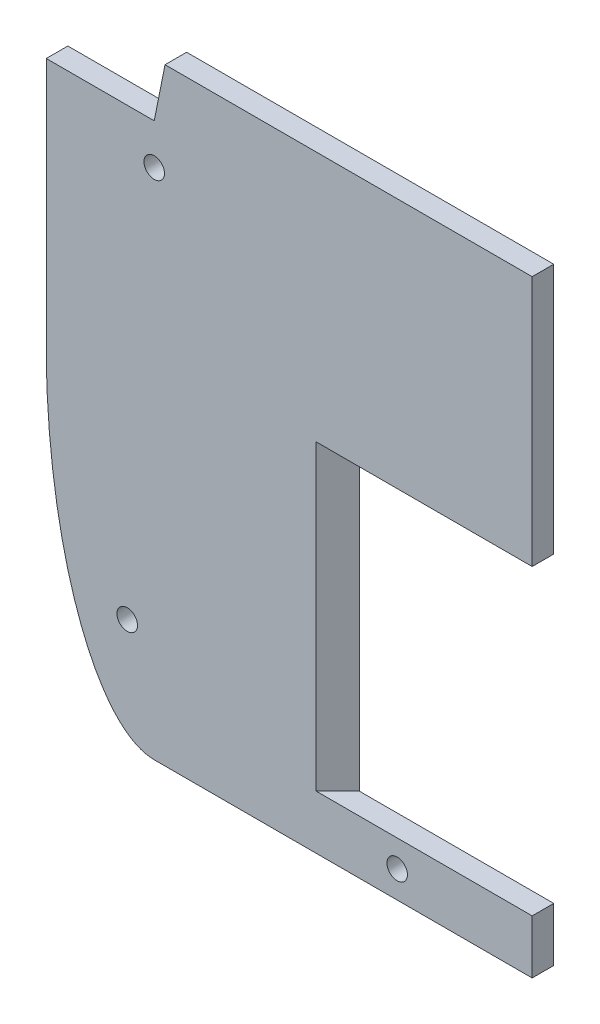
ISO-10303-21;
HEADER;
FILE_DESCRIPTION(('STEP AP214'),'2;1');
FILE_NAME('part.step','',(''),(''),'','','');
FILE_SCHEMA(('AUTOMOTIVE_DESIGN { 1 0 10303 214 1 1 1 1 }'));
ENDSEC;
DATA;
#1=APPLICATION_CONTEXT('core data for automotive mechanical design processes');
#2=APPLICATION_PROTOCOL_DEFINITION('international standard','automotive_design',2000,#1);
#3=PRODUCT_CONTEXT('',#1,'mechanical');
#4=PRODUCT('Part','Part','',(#3));
#5=PRODUCT_RELATED_PRODUCT_CATEGORY('part','',(#4));
#6=PRODUCT_DEFINITION_FORMATION('','',#4);
#7=PRODUCT_DEFINITION_CONTEXT('part definition',#1,'design');
#8=PRODUCT_DEFINITION('design','',#6,#7);
#9=PRODUCT_DEFINITION_SHAPE('','',#8);
#10=(LENGTH_UNIT() NAMED_UNIT(*) SI_UNIT(.MILLI.,.METRE.));
#11=(NAMED_UNIT(*) PLANE_ANGLE_UNIT() SI_UNIT($,.RADIAN.));
#12=(NAMED_UNIT(*) SI_UNIT($,.STERADIAN.) SOLID_ANGLE_UNIT());
#13=UNCERTAINTY_MEASURE_WITH_UNIT(LENGTH_MEASURE(1.E-05),#10,'distance_accuracy_value','');
#14=(GEOMETRIC_REPRESENTATION_CONTEXT(3) GLOBAL_UNCERTAINTY_ASSIGNED_CONTEXT((#13)) GLOBAL_UNIT_ASSIGNED_CONTEXT((#10,
#11,#12)) REPRESENTATION_CONTEXT('',''));
#15=CARTESIAN_POINT('',(0.,0.,0.));
#16=DIRECTION('',(0.,0.,1.));
#17=DIRECTION('',(1.,0.,0.));
#18=AXIS2_PLACEMENT_3D('',#15,#16,#17);
#19=CARTESIAN_POINT('',(0.,130.175,0.));
#20=DIRECTION('',(0.,1.,0.));
#21=DIRECTION('',(0.,0.,1.));
#22=AXIS2_PLACEMENT_3D('',#19,#20,#21);
#23=PLANE('',#22);
#24=DIRECTION('',(0.,0.,1.));
#25=VECTOR('',#24,1.);
#26=CARTESIAN_POINT('',(0.,130.175,0.));
#27=LINE('',#26,#25);
#28=CARTESIAN_POINT('',(0.,130.175,0.));
#29=VERTEX_POINT('',#28);
#30=CARTESIAN_POINT('',(0.,130.175,5.08));
#31=VERTEX_POINT('',#30);
#32=EDGE_CURVE('E279',#29,#31,#27,.T.);
#33=ORIENTED_EDGE('',*,*,#32,.T.);
#34=DIRECTION('',(1.,0.,0.));
#35=VECTOR('',#34,1.);
#36=CARTESIAN_POINT('',(0.,130.175,5.08));
#37=LINE('',#36,#35);
#38=CARTESIAN_POINT('',(25.4,130.175,5.08));
#39=VERTEX_POINT('',#38);
#40=EDGE_CURVE('E166',#31,#39,#37,.T.);
#41=ORIENTED_EDGE('',*,*,#40,.T.);
#42=DIRECTION('',(0.,0.,-1.));
#43=VECTOR('',#42,1.);
#44=CARTESIAN_POINT('',(25.4,130.175,0.));
#45=LINE('',#44,#43);
#46=CARTESIAN_POINT('',(25.4,130.175,0.));
#47=VERTEX_POINT('',#46);
#48=EDGE_CURVE('E315',#39,#47,#45,.T.);
#49=ORIENTED_EDGE('',*,*,#48,.T.);
#50=DIRECTION('',(-1.,0.,0.));
#51=VECTOR('',#50,1.);
#52=CARTESIAN_POINT('',(0.,130.175,0.));
#53=LINE('',#52,#51);
#54=EDGE_CURVE('E283',#47,#29,#53,.T.);
#55=ORIENTED_EDGE('',*,*,#54,.T.);
#56=EDGE_LOOP('',(#33,#41,#49,#55));
#57=FACE_BOUND('',#56,.T.);
#58=ADVANCED_FACE('F45',(#57),#23,.T.);
#59=CARTESIAN_POINT('',(114.3,0.,30.48));
#60=DIRECTION('',(-1.,0.,0.));
#61=DIRECTION('',(0.,0.,1.));
#62=AXIS2_PLACEMENT_3D('',#59,#60,#61);
#63=PLANE('',#62);
#64=DIRECTION('',(0.,1.,0.));
#65=VECTOR('',#64,1.);
#66=CARTESIAN_POINT('',(114.3,0.,0.));
#67=LINE('',#66,#65);
#68=CARTESIAN_POINT('',(114.3,0.,0.));
#69=VERTEX_POINT('',#68);
#70=CARTESIAN_POINT('',(114.3,12.6602922297252,0.));
#71=VERTEX_POINT('',#70);
#72=EDGE_CURVE('E143',#69,#71,#67,.T.);
#73=ORIENTED_EDGE('',*,*,#72,.T.);
#74=DIRECTION('',(0.,0.,1.));
#75=VECTOR('',#74,1.);
#76=CARTESIAN_POINT('',(114.3,12.6602922297252,-0.357505));
#77=LINE('',#76,#75);
#78=CARTESIAN_POINT('',(114.3,12.6602922297252,5.08));
#79=VERTEX_POINT('',#78);
#80=EDGE_CURVE('E130',#71,#79,#77,.T.);
#81=ORIENTED_EDGE('',*,*,#80,.T.);
#82=DIRECTION('',(0.,1.,0.));
#83=VECTOR('',#82,1.);
#84=CARTESIAN_POINT('',(114.3,0.,5.08));
#85=LINE('',#84,#83);
#86=CARTESIAN_POINT('',(114.3,0.,5.08));
#87=VERTEX_POINT('',#86);
#88=EDGE_CURVE('E140',#87,#79,#85,.T.);
#89=ORIENTED_EDGE('',*,*,#88,.F.);
#90=DIRECTION('',(0.,0.,-1.));
#91=VECTOR('',#90,1.);
#92=CARTESIAN_POINT('',(114.3,0.,30.48));
#93=LINE('',#92,#91);
#94=EDGE_CURVE('E306',#87,#69,#93,.T.);
#95=ORIENTED_EDGE('',*,*,#94,.T.);
#96=EDGE_LOOP('',(#73,#81,#89,#95));
#97=FACE_BOUND('',#96,.T.);
#98=ADVANCED_FACE('F139',(#97),#63,.F.);
#99=CARTESIAN_POINT('',(0.,142.875,30.48));
#100=DIRECTION('',(0.,1.,0.));
#101=DIRECTION('',(0.,0.,1.));
#102=AXIS2_PLACEMENT_3D('',#99,#100,#101);
#103=PLANE('',#102);
#104=DIRECTION('',(0.,0.,-1.));
#105=VECTOR('',#104,1.);
#106=CARTESIAN_POINT('',(27.94,142.875,0.));
#107=LINE('',#106,#105);
#108=CARTESIAN_POINT('',(27.94,142.875,5.08));
#109=VERTEX_POINT('',#108);
#110=CARTESIAN_POINT('',(27.94,142.875,0.));
#111=VERTEX_POINT('',#110);
#112=EDGE_CURVE('E271',#109,#111,#107,.T.);
#113=ORIENTED_EDGE('',*,*,#112,.F.);
#114=DIRECTION('',(-1.,0.,0.));
#115=VECTOR('',#114,1.);
#116=CARTESIAN_POINT('',(62.6533333333333,142.875,5.08));
#117=LINE('',#116,#115);
#118=CARTESIAN_POINT('',(114.3,142.875,5.08));
#119=VERTEX_POINT('',#118);
#120=EDGE_CURVE('E286',#119,#109,#117,.T.);
#121=ORIENTED_EDGE('',*,*,#120,.F.);
#122=DIRECTION('',(0.,0.,-1.));
#123=VECTOR('',#122,1.);
#124=CARTESIAN_POINT('',(114.3,142.875,30.48));
#125=LINE('',#124,#123);
#126=CARTESIAN_POINT('',(114.3,142.875,0.));
#127=VERTEX_POINT('',#126);
#128=EDGE_CURVE('E269',#119,#127,#125,.T.);
#129=ORIENTED_EDGE('',*,*,#128,.T.);
#130=DIRECTION('',(1.,0.,0.));
#131=VECTOR('',#130,1.);
#132=CARTESIAN_POINT('',(0.,142.875,0.));
#133=LINE('',#132,#131);
#134=EDGE_CURVE('E293',#111,#127,#133,.T.);
#135=ORIENTED_EDGE('',*,*,#134,.F.);
#136=EDGE_LOOP('',(#113,#121,#129,#135));
#137=FACE_BOUND('',#136,.T.);
#138=ADVANCED_FACE('F245',(#137),#103,.T.);
#139=CARTESIAN_POINT('',(0.,0.,30.48));
#140=DIRECTION('',(-1.,0.,0.));
#141=DIRECTION('',(0.,0.,1.));
#142=AXIS2_PLACEMENT_3D('',#139,#140,#141);
#143=PLANE('',#142);
#144=CARTESIAN_POINT('',(0.,71.501,32.004));
#145=CARTESIAN_POINT('',(0.,71.501,20.828));
#146=CARTESIAN_POINT('',(0.,71.501,9.65199999999998));
#147=CARTESIAN_POINT('',(0.,71.501,-1.524));
#148=(BOUNDED_CURVE() B_SPLINE_CURVE(3,(#144,#145,#146,#147),.UNSPECIFIED.,.F.,
.F.) B_SPLINE_CURVE_WITH_KNOTS((4,4),(-0.032004,0.001524),
.UNSPECIFIED.) CURVE() GEOMETRIC_REPRESENTATION_ITEM() RATIONAL_B_SPLINE_CURVE((1.,1.,1.,1.)) REPRESENTATION_ITEM(''));
#149=CARTESIAN_POINT('',(0.,71.501,0.));
#150=VERTEX_POINT('',#149);
#151=CARTESIAN_POINT('',(0.,71.5009999999999,5.08));
#152=VERTEX_POINT('',#151);
#153=EDGE_CURVE('E230',#150,#152,#148,.F.);
#154=ORIENTED_EDGE('',*,*,#153,.T.);
#155=DIRECTION('',(0.,1.,0.));
#156=VECTOR('',#155,1.);
#157=CARTESIAN_POINT('',(0.,0.,5.08));
#158=LINE('',#157,#156);
#159=EDGE_CURVE('E170',#152,#31,#158,.T.);
#160=ORIENTED_EDGE('',*,*,#159,.T.);
#161=ORIENTED_EDGE('',*,*,#32,.F.);
#162=DIRECTION('',(0.,1.,0.));
#163=VECTOR('',#162,1.);
#164=CARTESIAN_POINT('',(0.,0.,0.));
#165=LINE('',#164,#163);
#166=EDGE_CURVE('E289',#150,#29,#165,.T.);
#167=ORIENTED_EDGE('',*,*,#166,.F.);
#168=EDGE_LOOP('',(#154,#160,#161,#167));
#169=FACE_BOUND('',#168,.T.);
#170=ADVANCED_FACE('F236',(#169),#143,.T.);
#171=CARTESIAN_POINT('',(0.,0.,30.48));
#172=DIRECTION('',(0.,1.,0.));
#173=DIRECTION('',(0.,0.,1.));
#174=AXIS2_PLACEMENT_3D('',#171,#172,#173);
#175=PLANE('',#174);
#176=DIRECTION('',(1.,0.,0.));
#177=VECTOR('',#176,1.);
#178=CARTESIAN_POINT('',(114.3,0.,5.08));
#179=LINE('',#178,#177);
#180=CARTESIAN_POINT('',(25.4,0.,5.08));
#181=VERTEX_POINT('',#180);
#182=EDGE_CURVE('E149',#181,#87,#179,.T.);
#183=ORIENTED_EDGE('',*,*,#182,.F.);
#184=CARTESIAN_POINT('',(25.4,0.,-1.524));
#185=CARTESIAN_POINT('',(25.4,0.,9.65199999999998));
#186=CARTESIAN_POINT('',(25.4,0.,20.828));
#187=CARTESIAN_POINT('',(25.4,0.,32.004));
#188=(BOUNDED_CURVE() B_SPLINE_CURVE(3,(#184,#185,#186,#187),.UNSPECIFIED.,.F.,
.F.) B_SPLINE_CURVE_WITH_KNOTS((4,4),(-0.032004,0.001524),
.UNSPECIFIED.) CURVE() GEOMETRIC_REPRESENTATION_ITEM() RATIONAL_B_SPLINE_CURVE((1.,1.,1.,1.)) REPRESENTATION_ITEM(''));
#189=CARTESIAN_POINT('',(25.4,0.,0.));
#190=VERTEX_POINT('',#189);
#191=EDGE_CURVE('E309',#181,#190,#188,.F.);
#192=ORIENTED_EDGE('',*,*,#191,.T.);
#193=DIRECTION('',(1.,0.,0.));
#194=VECTOR('',#193,1.);
#195=CARTESIAN_POINT('',(0.,0.,0.));
#196=LINE('',#195,#194);
#197=EDGE_CURVE('E301',#190,#69,#196,.T.);
#198=ORIENTED_EDGE('',*,*,#197,.T.);
#199=ORIENTED_EDGE('',*,*,#94,.F.);
#200=EDGE_LOOP('',(#183,#192,#198,#199));
#201=FACE_BOUND('',#200,.T.);
#202=ADVANCED_FACE('F211',(#201),#175,.F.);
#203=DIRECTION('',(0.,-1.,0.));
#204=VECTOR('',#203,1.);
#205=CARTESIAN_POINT('',(114.3,142.875,5.08));
#206=LINE('',#205,#204);
#207=CARTESIAN_POINT('',(114.3,83.82,5.08));
#208=VERTEX_POINT('',#207);
#209=EDGE_CURVE('E266',#119,#208,#206,.T.);
#210=ORIENTED_EDGE('',*,*,#209,.T.);
#211=DIRECTION('',(0.,0.,1.));
#212=VECTOR('',#211,1.);
#213=CARTESIAN_POINT('',(114.3,83.82,-0.357505000000001));
#214=LINE('',#213,#212);
#215=CARTESIAN_POINT('',(114.3,83.82,0.));
#216=VERTEX_POINT('',#215);
#217=EDGE_CURVE('E180',#216,#208,#214,.T.);
#218=ORIENTED_EDGE('',*,*,#217,.F.);
#219=EDGE_CURVE('E296',#216,#127,#67,.T.);
#220=ORIENTED_EDGE('',*,*,#219,.T.);
#221=ORIENTED_EDGE('',*,*,#128,.F.);
#222=EDGE_LOOP('',(#210,#218,#220,#221));
#223=FACE_BOUND('',#222,.T.);
#224=ADVANCED_FACE('F249',(#223),#63,.F.);
#225=CARTESIAN_POINT('',(0.,71.501,-1.524));
#226=CARTESIAN_POINT('',(0.,71.501,9.65199999999998));
#227=CARTESIAN_POINT('',(0.,71.501,20.828));
#228=CARTESIAN_POINT('',(0.,71.501,32.004));
#229=CARTESIAN_POINT('',(0.,0.,-1.524));
#230=CARTESIAN_POINT('',(0.,0.,9.652));
#231=CARTESIAN_POINT('',(0.,0.,20.828));
#232=CARTESIAN_POINT('',(0.,0.,32.004));
#233=CARTESIAN_POINT('',(25.4,0.,-1.524));
#234=CARTESIAN_POINT('',(25.4,0.,9.65199999999998));
#235=CARTESIAN_POINT('',(25.4,0.,20.828));
#236=CARTESIAN_POINT('',(25.4,0.,32.004));
#237=(BOUNDED_SURFACE() B_SPLINE_SURFACE(2,3,((#225,#226,#227,#228),(#229,#230,#231,#232),(#233,
#234,#235,#236)),.UNSPECIFIED.,.F.,.F.,.F.) B_SPLINE_SURFACE_WITH_KNOTS((3,3),(4,4),(0.,1.),
(-0.032004,0.001524),
.UNSPECIFIED.) GEOMETRIC_REPRESENTATION_ITEM() RATIONAL_B_SPLINE_SURFACE(((1.,1.,1.,1.),
(0.707106781186548,0.707106781186548,0.707106781186548,0.707106781186548),(1.,1.,1.,1.))) REPRESENTATION_ITEM('') SURFACE());
#238=CARTESIAN_POINT('',(25.4,0.,5.08));
#239=CARTESIAN_POINT('',(25.2585860122023,-9.0215212536873E-06,5.08));
#240=CARTESIAN_POINT('',(25.1171755942518,0.00332423904097205,5.08));
#241=CARTESIAN_POINT('',(24.8346772667443,0.0166080583315453,5.08));
#242=CARTESIAN_POINT('',(24.693589331387,0.02655806766361,5.08));
#243=CARTESIAN_POINT('',(24.4122060787683,0.0529913874727229,5.08));
#244=CARTESIAN_POINT('',(24.2719099838915,0.0694664064660886,5.08));
#245=CARTESIAN_POINT('',(23.992227412516,0.108815361937403,5.08));
#246=CARTESIAN_POINT('',(23.8528409494403,0.131689392624398,5.08));
#247=CARTESIAN_POINT('',(23.4399230213521,0.209021358491837,5.08));
#248=CARTESIAN_POINT('',(23.1680364860621,0.27253539981299,5.08));
#249=CARTESIAN_POINT('',(22.6305635671967,0.422207479792944,5.08));
#250=CARTESIAN_POINT('',(22.3649795301767,0.50837381252486,5.08));
#251=CARTESIAN_POINT('',(21.7727493502009,0.726612142243885,5.08));
#252=CARTESIAN_POINT('',(21.44835020671,0.864796758731667,5.08));
#253=CARTESIAN_POINT('',(20.8132567579681,1.16960741913025,5.08));
#254=CARTESIAN_POINT('',(20.5025660239602,1.33624081995617,5.08));
#255=CARTESIAN_POINT('',(19.894030417116,1.69459512121806,5.08));
#256=CARTESIAN_POINT('',(19.5962566352296,1.88643596170706,5.08));
#257=CARTESIAN_POINT('',(19.0151312421199,2.29074210119645,5.08));
#258=CARTESIAN_POINT('',(18.7317800190247,2.50320795479344,5.08));
#259=CARTESIAN_POINT('',(18.222367845781,2.91080646251375,5.08));
#260=CARTESIAN_POINT('',(17.9942887982989,3.10343560573493,5.08));
#261=CARTESIAN_POINT('',(17.5475856253493,3.49940734794553,5.08));
#262=CARTESIAN_POINT('',(17.3289630046997,3.7027516407183,5.08));
#263=CARTESIAN_POINT('',(16.9006285263724,4.11881083003555,5.08));
#264=CARTESIAN_POINT('',(16.6909213613351,4.33153054423771,5.08));
#265=CARTESIAN_POINT('',(16.280026060165,4.7650623055023,5.08));
#266=CARTESIAN_POINT('',(16.0788389634683,4.98587533384246,5.08));
#267=CARTESIAN_POINT('',(15.48675938357,5.65952133258965,5.08));
#268=CARTESIAN_POINT('',(15.1079238621857,6.12299408547309,5.08));
#269=CARTESIAN_POINT('',(14.3789000097188,7.07152886991038,5.08));
#270=CARTESIAN_POINT('',(14.0287040810262,7.55658512265073,5.08));
#271=CARTESIAN_POINT('',(13.4644244734342,8.3817448859924,5.08));
#272=CARTESIAN_POINT('',(13.243406193471,8.71714434100942,5.08));
#273=CARTESIAN_POINT('',(12.8118801899846,9.39465474092647,5.08));
#274=CARTESIAN_POINT('',(12.6013729306144,9.73676598128259,5.08));
#275=CARTESIAN_POINT('',(12.1899112189294,10.4271135023538,5.08));
#276=CARTESIAN_POINT('',(11.9889660243714,10.7753552890348,5.08));
#277=CARTESIAN_POINT('',(11.596147643071,11.4769264675813,5.08));
#278=CARTESIAN_POINT('',(11.4042749096372,11.8302561125151,5.08));
#279=CARTESIAN_POINT('',(10.8409165910256,12.897698542031,5.08));
#280=CARTESIAN_POINT('',(10.4821213080517,13.6185354047856,5.08));
#281=CARTESIAN_POINT('',(9.79417636952739,15.0742345604926,5.08));
#282=CARTESIAN_POINT('',(9.46503119519156,15.8090989532453,5.08));
#283=CARTESIAN_POINT('',(8.83180172857683,17.2930465972007,5.08));
#284=CARTESIAN_POINT('',(8.52782477860622,18.042175514198,5.08));
#285=CARTESIAN_POINT('',(7.94395552539186,19.5489429489226,5.08));
#286=CARTESIAN_POINT('',(7.66404163507462,20.3065731353733,5.08));
#287=CARTESIAN_POINT('',(7.12584438663986,21.8291534029638,5.08));
#288=CARTESIAN_POINT('',(6.86755339949468,22.5941007953894,5.08));
#289=CARTESIAN_POINT('',(6.37065635728657,24.1302935085837,5.08));
#290=CARTESIAN_POINT('',(6.13204912479673,24.9015384496134,5.08));
#291=CARTESIAN_POINT('',(5.65863970840444,26.4976563998243,5.08));
#292=CARTESIAN_POINT('',(5.42500274577088,27.3228743981936,5.08));
#293=CARTESIAN_POINT('',(4.97661882954677,28.9784499115497,5.08));
#294=CARTESIAN_POINT('',(4.7618726755402,29.8088076424932,5.08));
#295=CARTESIAN_POINT('',(4.34994742999839,31.4739965569957,5.08));
#296=CARTESIAN_POINT('',(4.15277106385322,32.3088284133535,5.08));
#297=CARTESIAN_POINT('',(3.774916953169,33.9822333952396,5.08));
#298=CARTESIAN_POINT('',(3.59423966241316,34.8208066230039,5.08));
#299=CARTESIAN_POINT('',(3.24902275094178,36.4983792634344,5.08));
#300=CARTESIAN_POINT('',(3.08443182117957,37.3373681287272,5.08));
#301=CARTESIAN_POINT('',(2.76992688684121,39.0180976710103,5.08));
#302=CARTESIAN_POINT('',(2.62001321526853,39.8598384099887,5.08));
#303=CARTESIAN_POINT('',(2.19126778665267,42.3884745993755,5.08));
#304=CARTESIAN_POINT('',(1.9333934220981,44.0789713603618,5.07999999999999));
#305=CARTESIAN_POINT('',(1.55554169159465,46.8370868311624,5.07999999999999));
#306=CARTESIAN_POINT('',(1.41994053206695,47.9026173171392,5.08));
#307=CARTESIAN_POINT('',(1.16829181224888,50.0360365913969,5.08));
#308=CARTESIAN_POINT('',(1.05224497767234,51.1039254657145,5.08));
#309=CARTESIAN_POINT('',(0.839025375956488,53.2416396734098,5.08));
#310=CARTESIAN_POINT('',(0.741853696471642,54.3114651147964,5.08));
#311=CARTESIAN_POINT('',(0.565846297216988,56.4526711269948,5.08));
#312=CARTESIAN_POINT('',(0.487011422370323,57.5240517671791,5.08));
#313=CARTESIAN_POINT('',(0.347120699196828,59.6700552960419,5.08));
#314=CARTESIAN_POINT('',(0.286099593225491,60.7446804447369,5.08));
#315=CARTESIAN_POINT('',(0.181721919775679,62.8947417896343,5.08));
#316=CARTESIAN_POINT('',(0.138364614506677,63.9701779500818,5.08));
#317=CARTESIAN_POINT('',(0.0690849168218204,66.121482879127,5.08));
#318=CARTESIAN_POINT('',(0.0431604578577851,67.1973515813149,5.08));
#319=CARTESIAN_POINT('',(0.00862774109857301,69.3491475023618,5.08));
#320=CARTESIAN_POINT('',(1.59497846454637E-05,70.4250746644499,5.08));
#321=CARTESIAN_POINT('',(0.,71.501,5.08));
#322=B_SPLINE_CURVE_WITH_KNOTS('',3,(#238,#239,#240,#241,#242,#243,#244,#245,#246,#247,#248,
#249,#250,#251,#252,#253,#254,#255,#256,#257,#258,#259,#260,#261,#262,#263,#264,#265,#266,#267,
#268,#269,#270,#271,#272,#273,#274,#275,#276,#277,#278,#279,#280,#281,#282,#283,#284,#285,#286,
#287,#288,#289,#290,#291,#292,#293,#294,#295,#296,#297,#298,#299,#300,#301,#302,#303,#304,#305,
#306,#307,#308,#309,#310,#311,#312,#313,#314,#315,#316,#317,#318,#319,#320,#321),.UNSPECIFIED.,
.F.,.F.,(4,2,2,2,2,2,2,2,2,2,2,2,2,2,2,2,2,2,2,2,2,2,2,2,2,2,2,2,2,2,2,2,2,2,2,2,2,2,2,2,2,4),
(0.,0.42419652892811,0.848357840726102,1.27198188122767,1.69561215883571,2.53207274377105,
3.36884002400632,4.42499579986173,5.48142511466431,6.54307653704568,7.6047565146307,
8.5000163375825,9.39541810459054,10.2912854734806,11.1872618239044,12.9816318970405,
14.7755243988695,15.9803554240773,17.185239606077,18.3912675330614,19.5973556561011,
22.0120699594834,24.4271486042359,26.8520472388273,29.2747472770509,31.6965888998298,
34.118285549642,36.6910028019054,39.263828896238,41.8370533899425,44.4103486351624,
46.9751481644089,49.5400058713674,54.6691479963036,57.891371671358,61.1137149055149,
64.3362437676568,67.5589210880563,70.7878422660871,74.0166285630804,77.2450320413907,
80.4727765350149),.UNSPECIFIED.);
#323=EDGE_CURVE('E174',#181,#152,#322,.T.);
#324=CARTESIAN_POINT('',(0.,71.501,0.));
#325=CARTESIAN_POINT('',(0.,0.,0.));
#326=CARTESIAN_POINT('',(25.4,0.,0.));
#327=(BOUNDED_CURVE() B_SPLINE_CURVE(2,(#324,#325,#326),.UNSPECIFIED.,.F.,
.F.) B_SPLINE_CURVE_WITH_KNOTS((3,3),(0.,1.),
.UNSPECIFIED.) CURVE() GEOMETRIC_REPRESENTATION_ITEM() RATIONAL_B_SPLINE_CURVE((1.,
0.707106781186547,1.)) REPRESENTATION_ITEM(''));
#328=EDGE_CURVE('E312',#190,#150,#327,.F.);
#329=ORIENTED_EDGE('',*,*,#191,.F.);
#330=ORIENTED_EDGE('',*,*,#323,.T.);
#331=ORIENTED_EDGE('',*,*,#153,.F.);
#332=ORIENTED_EDGE('',*,*,#328,.F.);
#333=EDGE_LOOP('',(#329,#330,#331,#332));
#334=FACE_BOUND('',#333,.T.);
#335=ADVANCED_FACE('F190',(#334),#237,.T.);
#336=CARTESIAN_POINT('',(25.4,130.175,0.));
#337=DIRECTION('',(0.98058067569092,-0.196116135138187,0.));
#338=DIRECTION('',(0.,0.,-1.));
#339=AXIS2_PLACEMENT_3D('',#336,#337,#338);
#340=PLANE('',#339);
#341=DIRECTION('',(-0.196116135138187,-0.98058067569092,0.));
#342=VECTOR('',#341,1.);
#343=CARTESIAN_POINT('',(25.4,130.175,5.08));
#344=LINE('',#343,#342);
#345=EDGE_CURVE('E163',#109,#39,#344,.T.);
#346=ORIENTED_EDGE('',*,*,#345,.F.);
#347=ORIENTED_EDGE('',*,*,#112,.T.);
#348=DIRECTION('',(0.196116135138187,0.98058067569092,0.));
#349=VECTOR('',#348,1.);
#350=CARTESIAN_POINT('',(25.4,130.175,0.));
#351=LINE('',#350,#349);
#352=EDGE_CURVE('E317',#47,#111,#351,.T.);
#353=ORIENTED_EDGE('',*,*,#352,.F.);
#354=ORIENTED_EDGE('',*,*,#48,.F.);
#355=EDGE_LOOP('',(#346,#347,#353,#354));
#356=FACE_BOUND('',#355,.T.);
#357=ADVANCED_FACE('F260',(#356),#340,.F.);
#358=CARTESIAN_POINT('',(114.3,83.82,-0.357505000000001));
#359=DIRECTION('',(0.,1.,0.));
#360=DIRECTION('',(0.,0.,1.));
#361=AXIS2_PLACEMENT_3D('',#358,#359,#360);
#362=PLANE('',#361);
#363=DIRECTION('',(1.,0.,0.));
#364=VECTOR('',#363,1.);
#365=CARTESIAN_POINT('',(114.3,83.82,5.08));
#366=LINE('',#365,#364);
#367=CARTESIAN_POINT('',(63.5,83.82,5.08));
#368=VERTEX_POINT('',#367);
#369=EDGE_CURVE('E68',#368,#208,#366,.T.);
#370=ORIENTED_EDGE('',*,*,#369,.F.);
#371=DIRECTION('',(0.707106781186548,0.,-0.707106781186547));
#372=VECTOR('',#371,1.);
#373=CARTESIAN_POINT('',(91.6187525,83.82,-23.0387525));
#374=LINE('',#373,#372);
#375=CARTESIAN_POINT('',(68.58,83.82,0.));
#376=VERTEX_POINT('',#375);
#377=EDGE_CURVE('E13',#368,#376,#374,.T.);
#378=ORIENTED_EDGE('',*,*,#377,.T.);
#379=DIRECTION('',(1.,0.,0.));
#380=VECTOR('',#379,1.);
#381=CARTESIAN_POINT('',(0.,83.82,0.));
#382=LINE('',#381,#380);
#383=EDGE_CURVE('E275',#376,#216,#382,.T.);
#384=ORIENTED_EDGE('',*,*,#383,.T.);
#385=ORIENTED_EDGE('',*,*,#217,.T.);
#386=EDGE_LOOP('',(#370,#378,#384,#385));
#387=FACE_BOUND('',#386,.T.);
#388=ADVANCED_FACE('F198',(#387),#362,.F.);
#389=CARTESIAN_POINT('',(0.,0.,0.));
#390=DIRECTION('',(0.,0.,-1.));
#391=DIRECTION('',(-1.,0.,0.));
#392=AXIS2_PLACEMENT_3D('',#389,#390,#391);
#393=PLANE('',#392);
#394=CARTESIAN_POINT('',(25.4,120.65,0.));
#395=DIRECTION('',(0.,0.,-1.));
#396=DIRECTION('',(-1.,0.,0.));
#397=AXIS2_PLACEMENT_3D('',#394,#395,#396);
#398=CIRCLE('',#397,2.41299999999999);
#399=CARTESIAN_POINT('',(22.987,120.65,0.));
#400=VERTEX_POINT('',#399);
#401=EDGE_CURVE('E134',#400,#400,#398,.T.);
#402=ORIENTED_EDGE('',*,*,#401,.F.);
#403=EDGE_LOOP('',(#402));
#404=FACE_BOUND('',#403,.T.);
#405=CARTESIAN_POINT('',(19.05,25.4,0.));
#406=DIRECTION('',(0.,0.,-1.));
#407=DIRECTION('',(-1.,0.,0.));
#408=AXIS2_PLACEMENT_3D('',#405,#406,#407);
#409=CIRCLE('',#408,2.413);
#410=CARTESIAN_POINT('',(16.637,25.4,0.));
#411=VERTEX_POINT('',#410);
#412=EDGE_CURVE('E359',#411,#411,#409,.T.);
#413=ORIENTED_EDGE('',*,*,#412,.F.);
#414=EDGE_LOOP('',(#413));
#415=FACE_BOUND('',#414,.T.);
#416=CARTESIAN_POINT('',(82.55,6.34999999999999,0.));
#417=DIRECTION('',(0.,0.,-1.));
#418=DIRECTION('',(-1.,0.,0.));
#419=AXIS2_PLACEMENT_3D('',#416,#417,#418);
#420=CIRCLE('',#419,2.413);
#421=CARTESIAN_POINT('',(80.137,6.34999999999999,0.));
#422=VERTEX_POINT('',#421);
#423=EDGE_CURVE('E363',#422,#422,#420,.T.);
#424=ORIENTED_EDGE('',*,*,#423,.F.);
#425=EDGE_LOOP('',(#424));
#426=FACE_BOUND('',#425,.T.);
#427=DIRECTION('',(-1.,0.,0.));
#428=VECTOR('',#427,1.);
#429=CARTESIAN_POINT('',(0.,12.6602922297252,0.));
#430=LINE('',#429,#428);
#431=CARTESIAN_POINT('',(68.58,12.6602922297252,0.));
#432=VERTEX_POINT('',#431);
#433=EDGE_CURVE('E151',#71,#432,#430,.T.);
#434=ORIENTED_EDGE('',*,*,#433,.F.);
#435=ORIENTED_EDGE('',*,*,#72,.F.);
#436=ORIENTED_EDGE('',*,*,#197,.F.);
#437=ORIENTED_EDGE('',*,*,#328,.T.);
#438=ORIENTED_EDGE('',*,*,#166,.T.);
#439=ORIENTED_EDGE('',*,*,#54,.F.);
#440=ORIENTED_EDGE('',*,*,#352,.T.);
#441=ORIENTED_EDGE('',*,*,#134,.T.);
#442=ORIENTED_EDGE('',*,*,#219,.F.);
#443=ORIENTED_EDGE('',*,*,#383,.F.);
#444=DIRECTION('',(0.,1.,0.));
#445=VECTOR('',#444,1.);
#446=CARTESIAN_POINT('',(68.58,0.,0.));
#447=LINE('',#446,#445);
#448=EDGE_CURVE('E145',#432,#376,#447,.T.);
#449=ORIENTED_EDGE('',*,*,#448,.F.);
#450=EDGE_LOOP('',(#434,#435,#436,#437,#438,#439,#440,#441,#442,#443,#449));
#451=FACE_BOUND('',#450,.T.);
#452=ADVANCED_FACE('F205',(#404,#415,#426,#451),#393,.T.);
#453=CARTESIAN_POINT('',(70.2733333333333,132.55668962475,5.08));
#454=DIRECTION('',(0.,0.,1.));
#455=DIRECTION('',(1.,0.,0.));
#456=AXIS2_PLACEMENT_3D('',#453,#454,#455);
#457=PLANE('',#456);
#458=CARTESIAN_POINT('',(25.4,120.65,5.08));
#459=DIRECTION('',(0.,0.,1.));
#460=DIRECTION('',(1.,0.,0.));
#461=AXIS2_PLACEMENT_3D('',#458,#459,#460);
#462=CIRCLE('',#461,2.41299999999999);
#463=CARTESIAN_POINT('',(27.813,120.65,5.08));
#464=VERTEX_POINT('',#463);
#465=EDGE_CURVE('E367',#464,#464,#462,.T.);
#466=ORIENTED_EDGE('',*,*,#465,.F.);
#467=EDGE_LOOP('',(#466));
#468=FACE_BOUND('',#467,.T.);
#469=CARTESIAN_POINT('',(19.05,25.4,5.08));
#470=DIRECTION('',(0.,0.,1.));
#471=DIRECTION('',(1.,0.,0.));
#472=AXIS2_PLACEMENT_3D('',#469,#470,#471);
#473=CIRCLE('',#472,2.413);
#474=CARTESIAN_POINT('',(21.463,25.4,5.08));
#475=VERTEX_POINT('',#474);
#476=EDGE_CURVE('E372',#475,#475,#473,.T.);
#477=ORIENTED_EDGE('',*,*,#476,.F.);
#478=EDGE_LOOP('',(#477));
#479=FACE_BOUND('',#478,.T.);
#480=CARTESIAN_POINT('',(82.55,6.34999999999999,5.08));
#481=DIRECTION('',(0.,0.,1.));
#482=DIRECTION('',(1.,0.,0.));
#483=AXIS2_PLACEMENT_3D('',#480,#481,#482);
#484=CIRCLE('',#483,2.413);
#485=CARTESIAN_POINT('',(84.963,6.34999999999999,5.08));
#486=VERTEX_POINT('',#485);
#487=EDGE_CURVE('E368',#486,#486,#484,.T.);
#488=ORIENTED_EDGE('',*,*,#487,.F.);
#489=EDGE_LOOP('',(#488));
#490=FACE_BOUND('',#489,.T.);
#491=DIRECTION('',(1.,0.,0.));
#492=VECTOR('',#491,1.);
#493=CARTESIAN_POINT('',(114.3,12.6602922297252,5.08));
#494=LINE('',#493,#492);
#495=CARTESIAN_POINT('',(63.5,12.6602922297252,5.08));
#496=VERTEX_POINT('',#495);
#497=EDGE_CURVE('E61',#496,#79,#494,.T.);
#498=ORIENTED_EDGE('',*,*,#497,.F.);
#499=DIRECTION('',(0.,1.,0.));
#500=VECTOR('',#499,1.);
#501=CARTESIAN_POINT('',(63.5,83.82,5.08));
#502=LINE('',#501,#500);
#503=EDGE_CURVE('E272',#496,#368,#502,.T.);
#504=ORIENTED_EDGE('',*,*,#503,.T.);
#505=ORIENTED_EDGE('',*,*,#369,.T.);
#506=ORIENTED_EDGE('',*,*,#209,.F.);
#507=ORIENTED_EDGE('',*,*,#120,.T.);
#508=ORIENTED_EDGE('',*,*,#345,.T.);
#509=ORIENTED_EDGE('',*,*,#40,.F.);
#510=ORIENTED_EDGE('',*,*,#159,.F.);
#511=ORIENTED_EDGE('',*,*,#323,.F.);
#512=ORIENTED_EDGE('',*,*,#182,.T.);
#513=ORIENTED_EDGE('',*,*,#88,.T.);
#514=EDGE_LOOP('',(#498,#504,#505,#506,#507,#508,#509,#510,#511,#512,#513));
#515=FACE_BOUND('',#514,.T.);
#516=ADVANCED_FACE('F147',(#468,#479,#490,#515),#457,.T.);
#517=CARTESIAN_POINT('',(114.3,12.6602922297252,-0.357505));
#518=DIRECTION('',(0.,-1.,0.));
#519=DIRECTION('',(1.,0.,0.));
#520=AXIS2_PLACEMENT_3D('',#517,#518,#519);
#521=PLANE('',#520);
#522=ORIENTED_EDGE('',*,*,#433,.T.);
#523=DIRECTION('',(-0.707106781186548,0.,0.707106781186547));
#524=VECTOR('',#523,1.);
#525=CARTESIAN_POINT('',(91.6187525,12.6602922297252,-23.0387525));
#526=LINE('',#525,#524);
#527=EDGE_CURVE('E54',#432,#496,#526,.T.);
#528=ORIENTED_EDGE('',*,*,#527,.T.);
#529=ORIENTED_EDGE('',*,*,#497,.T.);
#530=ORIENTED_EDGE('',*,*,#80,.F.);
#531=EDGE_LOOP('',(#522,#528,#529,#530));
#532=FACE_BOUND('',#531,.T.);
#533=ADVANCED_FACE('F129',(#532),#521,.F.);
#534=CARTESIAN_POINT('',(68.58,83.82,0.));
#535=DIRECTION('',(0.707106781186547,0.,0.707106781186548));
#536=DIRECTION('',(0.,1.,0.));
#537=AXIS2_PLACEMENT_3D('',#534,#535,#536);
#538=PLANE('',#537);
#539=ORIENTED_EDGE('',*,*,#377,.F.);
#540=ORIENTED_EDGE('',*,*,#503,.F.);
#541=ORIENTED_EDGE('',*,*,#527,.F.);
#542=ORIENTED_EDGE('',*,*,#448,.T.);
#543=EDGE_LOOP('',(#539,#540,#541,#542));
#544=FACE_BOUND('',#543,.T.);
#545=ADVANCED_FACE('F47',(#544),#538,.T.);
#546=CARTESIAN_POINT('',(82.55,6.34999999999999,-0.357505));
#547=DIRECTION('',(0.,0.,1.));
#548=DIRECTION('',(1.,0.,0.));
#549=AXIS2_PLACEMENT_3D('',#546,#547,#548);
#550=CYLINDRICAL_SURFACE('',#549,2.413);
#551=ORIENTED_EDGE('',*,*,#423,.T.);
#552=EDGE_LOOP('',(#551));
#553=FACE_BOUND('',#552,.T.);
#554=ORIENTED_EDGE('',*,*,#487,.T.);
#555=EDGE_LOOP('',(#554));
#556=FACE_BOUND('',#555,.T.);
#557=ADVANCED_FACE('F386',(#553,#556),#550,.F.);
#558=CARTESIAN_POINT('',(19.05,25.4,-0.357505));
#559=DIRECTION('',(0.,0.,1.));
#560=DIRECTION('',(1.,0.,0.));
#561=AXIS2_PLACEMENT_3D('',#558,#559,#560);
#562=CYLINDRICAL_SURFACE('',#561,2.413);
#563=ORIENTED_EDGE('',*,*,#412,.T.);
#564=EDGE_LOOP('',(#563));
#565=FACE_BOUND('',#564,.T.);
#566=ORIENTED_EDGE('',*,*,#476,.T.);
#567=EDGE_LOOP('',(#566));
#568=FACE_BOUND('',#567,.T.);
#569=ADVANCED_FACE('F388',(#565,#568),#562,.F.);
#570=CARTESIAN_POINT('',(25.4,120.65,-0.357505));
#571=DIRECTION('',(0.,0.,1.));
#572=DIRECTION('',(1.,0.,0.));
#573=AXIS2_PLACEMENT_3D('',#570,#571,#572);
#574=CYLINDRICAL_SURFACE('',#573,2.41299999999999);
#575=ORIENTED_EDGE('',*,*,#401,.T.);
#576=EDGE_LOOP('',(#575));
#577=FACE_BOUND('',#576,.T.);
#578=ORIENTED_EDGE('',*,*,#465,.T.);
#579=EDGE_LOOP('',(#578));
#580=FACE_BOUND('',#579,.T.);
#581=ADVANCED_FACE('F380',(#577,#580),#574,.F.);
#582=CLOSED_SHELL('',(#58,#98,#138,#170,#202,#224,#335,#357,#388,#452,#516,#533,#545,#557,#569,#581));
#583=MANIFOLD_SOLID_BREP('B2',#582);
#584=ADVANCED_BREP_SHAPE_REPRESENTATION('',(#18,#583),#14);
#585=SHAPE_DEFINITION_REPRESENTATION(#9,#584);
ENDSEC;
END-ISO-10303-21;
